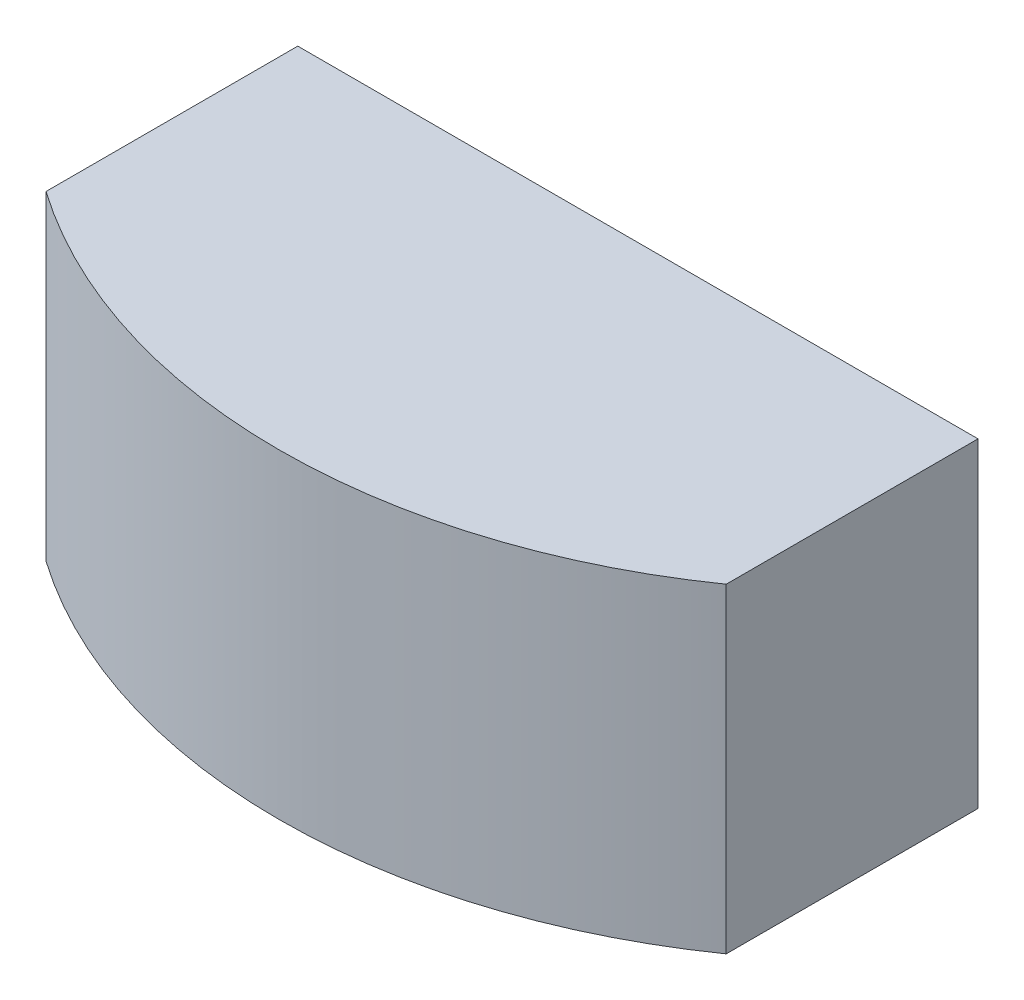
ISO-10303-21;
HEADER;
FILE_DESCRIPTION(('STEP AP214'),'2;1');
FILE_NAME('part.step','',(''),(''),'','','');
FILE_SCHEMA(('AUTOMOTIVE_DESIGN { 1 0 10303 214 1 1 1 1 }'));
ENDSEC;
DATA;
#1=APPLICATION_CONTEXT('core data for automotive mechanical design processes');
#2=APPLICATION_PROTOCOL_DEFINITION('international standard','automotive_design',2000,#1);
#3=PRODUCT_CONTEXT('',#1,'mechanical');
#4=PRODUCT('Part','Part','',(#3));
#5=PRODUCT_RELATED_PRODUCT_CATEGORY('part','',(#4));
#6=PRODUCT_DEFINITION_FORMATION('','',#4);
#7=PRODUCT_DEFINITION_CONTEXT('part definition',#1,'design');
#8=PRODUCT_DEFINITION('design','',#6,#7);
#9=PRODUCT_DEFINITION_SHAPE('','',#8);
#10=(LENGTH_UNIT() NAMED_UNIT(*) SI_UNIT(.MILLI.,.METRE.));
#11=(NAMED_UNIT(*) PLANE_ANGLE_UNIT() SI_UNIT($,.RADIAN.));
#12=(NAMED_UNIT(*) SI_UNIT($,.STERADIAN.) SOLID_ANGLE_UNIT());
#13=UNCERTAINTY_MEASURE_WITH_UNIT(LENGTH_MEASURE(1.E-05),#10,'distance_accuracy_value','');
#14=(GEOMETRIC_REPRESENTATION_CONTEXT(3) GLOBAL_UNCERTAINTY_ASSIGNED_CONTEXT((#13)) GLOBAL_UNIT_ASSIGNED_CONTEXT((#10,
#11,#12)) REPRESENTATION_CONTEXT('',''));
#15=CARTESIAN_POINT('',(0.,0.,0.));
#16=DIRECTION('',(0.,0.,1.));
#17=DIRECTION('',(1.,0.,0.));
#18=AXIS2_PLACEMENT_3D('',#15,#16,#17);
#19=CARTESIAN_POINT('',(-2.10387263166466E-12,-324.393398282201,-268.336309447892));
#20=DIRECTION('',(0.,1.,0.));
#21=DIRECTION('',(-0.656059028990481,0.,0.754709580222795));
#22=AXIS2_PLACEMENT_3D('',#19,#20,#21);
#23=CYLINDRICAL_SURFACE('',#22,675.);
#24=DIRECTION('',(0.,1.,0.));
#25=VECTOR('',#24,1.);
#26=CARTESIAN_POINT('',(-385.,-324.393398282203,286.100341577274));
#27=LINE('',#26,#25);
#28=CARTESIAN_POINT('',(-385.,-324.393398282199,286.100341577274));
#29=VERTEX_POINT('',#28);
#30=CARTESIAN_POINT('',(-385.,32.7297077300907,286.100341577275));
#31=VERTEX_POINT('',#30);
#32=EDGE_CURVE('E159',#29,#31,#27,.T.);
#33=ORIENTED_EDGE('',*,*,#32,.T.);
#34=CARTESIAN_POINT('',(-9.54062376395223E-13,32.7297077300907,-268.33630944789));
#35=DIRECTION('',(0.,1.,0.));
#36=DIRECTION('',(0.,0.,1.));
#37=AXIS2_PLACEMENT_3D('',#34,#35,#36);
#38=CIRCLE('',#37,675.);
#39=CARTESIAN_POINT('',(385.,32.7297077300907,286.100341577273));
#40=VERTEX_POINT('',#39);
#41=EDGE_CURVE('E164',#31,#40,#38,.T.);
#42=ORIENTED_EDGE('',*,*,#41,.T.);
#43=DIRECTION('',(0.,1.,0.));
#44=VECTOR('',#43,1.);
#45=CARTESIAN_POINT('',(385.,-324.393398282203,286.100341577271));
#46=LINE('',#45,#44);
#47=CARTESIAN_POINT('',(385.,-324.393398282199,286.100341577271));
#48=VERTEX_POINT('',#47);
#49=EDGE_CURVE('E163',#40,#48,#46,.F.);
#50=ORIENTED_EDGE('',*,*,#49,.T.);
#51=CARTESIAN_POINT('',(-2.10387263166465E-12,-324.393398282199,-268.336309447892));
#52=DIRECTION('',(0.,-1.,0.));
#53=DIRECTION('',(0.,0.,-1.));
#54=AXIS2_PLACEMENT_3D('',#51,#52,#53);
#55=CIRCLE('',#54,675.);
#56=EDGE_CURVE('E167',#48,#29,#55,.T.);
#57=ORIENTED_EDGE('',*,*,#56,.T.);
#58=EDGE_LOOP('',(#33,#42,#50,#57));
#59=FACE_BOUND('',#58,.T.);
#60=ADVANCED_FACE('F35',(#59),#23,.F.);
#61=CARTESIAN_POINT('',(0.,0.,5.));
#62=DIRECTION('',(0.,0.,-1.));
#63=DIRECTION('',(-1.,0.,0.));
#64=AXIS2_PLACEMENT_3D('',#61,#62,#63);
#65=PLANE('',#64);
#66=DIRECTION('',(1.,0.,0.));
#67=VECTOR('',#66,1.);
#68=CARTESIAN_POINT('',(385.,32.7297077300907,5.));
#69=LINE('',#68,#67);
#70=CARTESIAN_POINT('',(19.0562648990521,32.7297077300907,5.));
#71=VERTEX_POINT('',#70);
#72=CARTESIAN_POINT('',(385.,32.7297077300907,5.));
#73=VERTEX_POINT('',#72);
#74=EDGE_CURVE('E182',#71,#73,#69,.T.);
#75=ORIENTED_EDGE('',*,*,#74,.F.);
#76=CARTESIAN_POINT('',(2.46830333949788E-12,-47.7297077300925,5.));
#77=DIRECTION('',(0.,0.,-1.));
#78=DIRECTION('',(0.,1.,0.));
#79=AXIS2_PLACEMENT_3D('',#76,#77,#78);
#80=ELLIPSE('',#79,84.8528137423858,59.9999999999976);
#81=CARTESIAN_POINT('',(-19.0562648990495,32.7297077300907,5.));
#82=VERTEX_POINT('',#81);
#83=EDGE_CURVE('E120',#71,#82,#80,.T.);
#84=ORIENTED_EDGE('',*,*,#83,.T.);
#85=CARTESIAN_POINT('',(-385.,32.7297077300907,5.));
#86=VERTEX_POINT('',#85);
#87=EDGE_CURVE('E126',#86,#82,#69,.T.);
#88=ORIENTED_EDGE('',*,*,#87,.F.);
#89=DIRECTION('',(0.,1.,0.));
#90=VECTOR('',#89,1.);
#91=CARTESIAN_POINT('',(-385.,32.7297077300907,5.));
#92=LINE('',#91,#90);
#93=CARTESIAN_POINT('',(-385.,-324.393398282199,5.));
#94=VERTEX_POINT('',#93);
#95=EDGE_CURVE('E179',#94,#86,#92,.T.);
#96=ORIENTED_EDGE('',*,*,#95,.F.);
#97=DIRECTION('',(-1.,0.,0.));
#98=VECTOR('',#97,1.);
#99=CARTESIAN_POINT('',(385.,-324.393398282199,5.));
#100=LINE('',#99,#98);
#101=CARTESIAN_POINT('',(385.,-324.393398282199,5.));
#102=VERTEX_POINT('',#101);
#103=EDGE_CURVE('E178',#102,#94,#100,.T.);
#104=ORIENTED_EDGE('',*,*,#103,.F.);
#105=DIRECTION('',(0.,-1.,0.));
#106=VECTOR('',#105,1.);
#107=CARTESIAN_POINT('',(385.,32.7297077300907,5.));
#108=LINE('',#107,#106);
#109=EDGE_CURVE('E184',#73,#102,#108,.T.);
#110=ORIENTED_EDGE('',*,*,#109,.F.);
#111=EDGE_LOOP('',(#75,#84,#88,#96,#104,#110));
#112=FACE_BOUND('',#111,.T.);
#113=ADVANCED_FACE('F198',(#112),#65,.F.);
#114=CARTESIAN_POINT('',(385.,32.7297077300907,421.66469055211));
#115=DIRECTION('',(0.,1.,0.));
#116=DIRECTION('',(0.,0.,1.));
#117=AXIS2_PLACEMENT_3D('',#114,#115,#116);
#118=PLANE('',#117);
#119=DIRECTION('',(-1.,0.,0.));
#120=VECTOR('',#119,1.);
#121=CARTESIAN_POINT('',(385.,32.7297077300907,10.));
#122=LINE('',#121,#120);
#123=CARTESIAN_POINT('',(19.0562648990521,32.7297077300907,10.));
#124=VERTEX_POINT('',#123);
#125=CARTESIAN_POINT('',(-19.0562648990495,32.7297077300907,10.));
#126=VERTEX_POINT('',#125);
#127=EDGE_CURVE('E111',#124,#126,#122,.T.);
#128=ORIENTED_EDGE('',*,*,#127,.F.);
#129=DIRECTION('',(0.,0.,-1.));
#130=VECTOR('',#129,1.);
#131=CARTESIAN_POINT('',(19.0562648990521,32.7297077300907,10.));
#132=LINE('',#131,#130);
#133=EDGE_CURVE('E12',#124,#71,#132,.T.);
#134=ORIENTED_EDGE('',*,*,#133,.T.);
#135=ORIENTED_EDGE('',*,*,#74,.T.);
#136=DIRECTION('',(0.,0.,-1.));
#137=VECTOR('',#136,1.);
#138=CARTESIAN_POINT('',(385.,32.7297077300907,421.66469055211));
#139=LINE('',#138,#137);
#140=EDGE_CURVE('E160',#40,#73,#139,.T.);
#141=ORIENTED_EDGE('',*,*,#140,.F.);
#142=ORIENTED_EDGE('',*,*,#41,.F.);
#143=DIRECTION('',(0.,0.,-1.));
#144=VECTOR('',#143,1.);
#145=CARTESIAN_POINT('',(-385.,32.7297077300907,421.66469055211));
#146=LINE('',#145,#144);
#147=EDGE_CURVE('E130',#31,#86,#146,.T.);
#148=ORIENTED_EDGE('',*,*,#147,.T.);
#149=ORIENTED_EDGE('',*,*,#87,.T.);
#150=DIRECTION('',(0.,0.,-1.));
#151=VECTOR('',#150,1.);
#152=CARTESIAN_POINT('',(-19.0562648990495,32.7297077300907,10.));
#153=LINE('',#152,#151);
#154=EDGE_CURVE('E43',#82,#126,#153,.F.);
#155=ORIENTED_EDGE('',*,*,#154,.T.);
#156=EDGE_LOOP('',(#128,#134,#135,#141,#142,#148,#149,#155));
#157=FACE_BOUND('',#156,.T.);
#158=ADVANCED_FACE('F124',(#157),#118,.F.);
#159=CARTESIAN_POINT('',(385.,32.7297077300907,421.66469055211));
#160=DIRECTION('',(1.,0.,0.));
#161=DIRECTION('',(0.,0.,-1.));
#162=AXIS2_PLACEMENT_3D('',#159,#160,#161);
#163=PLANE('',#162);
#164=ORIENTED_EDGE('',*,*,#140,.T.);
#165=ORIENTED_EDGE('',*,*,#109,.T.);
#166=DIRECTION('',(0.,0.,-1.));
#167=VECTOR('',#166,1.);
#168=CARTESIAN_POINT('',(385.,-324.393398282199,421.66469055211));
#169=LINE('',#168,#167);
#170=EDGE_CURVE('E165',#48,#102,#169,.T.);
#171=ORIENTED_EDGE('',*,*,#170,.F.);
#172=ORIENTED_EDGE('',*,*,#49,.F.);
#173=EDGE_LOOP('',(#164,#165,#171,#172));
#174=FACE_BOUND('',#173,.T.);
#175=ADVANCED_FACE('F208',(#174),#163,.F.);
#176=CARTESIAN_POINT('',(385.,-324.393398282199,421.66469055211));
#177=DIRECTION('',(0.,-1.,0.));
#178=DIRECTION('',(0.,0.,-1.));
#179=AXIS2_PLACEMENT_3D('',#176,#177,#178);
#180=PLANE('',#179);
#181=ORIENTED_EDGE('',*,*,#170,.T.);
#182=ORIENTED_EDGE('',*,*,#103,.T.);
#183=DIRECTION('',(0.,0.,-1.));
#184=VECTOR('',#183,1.);
#185=CARTESIAN_POINT('',(-385.,-324.393398282199,421.66469055211));
#186=LINE('',#185,#184);
#187=EDGE_CURVE('E168',#29,#94,#186,.T.);
#188=ORIENTED_EDGE('',*,*,#187,.F.);
#189=ORIENTED_EDGE('',*,*,#56,.F.);
#190=EDGE_LOOP('',(#181,#182,#188,#189));
#191=FACE_BOUND('',#190,.T.);
#192=ADVANCED_FACE('F204',(#191),#180,.F.);
#193=CARTESIAN_POINT('',(-385.,32.7297077300907,421.66469055211));
#194=DIRECTION('',(-1.,0.,0.));
#195=DIRECTION('',(0.,0.,1.));
#196=AXIS2_PLACEMENT_3D('',#193,#194,#195);
#197=PLANE('',#196);
#198=ORIENTED_EDGE('',*,*,#187,.T.);
#199=ORIENTED_EDGE('',*,*,#95,.T.);
#200=ORIENTED_EDGE('',*,*,#147,.F.);
#201=ORIENTED_EDGE('',*,*,#32,.F.);
#202=EDGE_LOOP('',(#198,#199,#200,#201));
#203=FACE_BOUND('',#202,.T.);
#204=ADVANCED_FACE('F196',(#203),#197,.F.);
#205=CARTESIAN_POINT('',(2.46830333949788E-12,-47.7297077300925,10.));
#206=DIRECTION('',(0.,0.,-1.));
#207=DIRECTION('',(0.,1.,0.));
#208=AXIS2_PLACEMENT_3D('',#205,#206,#207);
#209=ELLIPSE('',#208,84.8528137423858,59.9999999999976);
#210=DIRECTION('',(0.,0.,-1.));
#211=VECTOR('',#210,1.);
#212=SURFACE_OF_LINEAR_EXTRUSION('',#209,#211);
#213=CARTESIAN_POINT('',(2.46830333949788E-12,-47.7297077300925,0.));
#214=DIRECTION('',(0.,0.,-1.));
#215=DIRECTION('',(0.,1.,0.));
#216=AXIS2_PLACEMENT_3D('',#213,#214,#215);
#217=ELLIPSE('',#216,84.8528137423858,59.9999999999976);
#218=CARTESIAN_POINT('',(0.,37.1231060122933,0.));
#219=VERTEX_POINT('',#218);
#220=EDGE_CURVE('E121',#219,#219,#217,.T.);
#221=ORIENTED_EDGE('',*,*,#220,.T.);
#222=EDGE_LOOP('',(#221));
#223=FACE_BOUND('',#222,.T.);
#224=EDGE_CURVE('E49',#126,#124,#209,.T.);
#225=ORIENTED_EDGE('',*,*,#224,.F.);
#226=ORIENTED_EDGE('',*,*,#154,.F.);
#227=ORIENTED_EDGE('',*,*,#83,.F.);
#228=ORIENTED_EDGE('',*,*,#133,.F.);
#229=EDGE_LOOP('',(#225,#226,#227,#228));
#230=FACE_BOUND('',#229,.T.);
#231=ADVANCED_FACE('F118',(#223,#230),#212,.F.);
#232=CARTESIAN_POINT('',(2.46830333949788E-12,-47.7297077300925,10.));
#233=DIRECTION('',(0.,0.,-1.));
#234=DIRECTION('',(-1.,0.,0.));
#235=AXIS2_PLACEMENT_3D('',#232,#233,#234);
#236=PLANE('',#235);
#237=ORIENTED_EDGE('',*,*,#127,.T.);
#238=ORIENTED_EDGE('',*,*,#224,.T.);
#239=EDGE_LOOP('',(#237,#238));
#240=FACE_BOUND('',#239,.T.);
#241=ADVANCED_FACE('F112',(#240),#236,.T.);
#242=CARTESIAN_POINT('',(-390.000000000001,-329.393398282201,411.664690552111));
#243=DIRECTION('',(0.,1.,0.));
#244=DIRECTION('',(-1.,0.,0.));
#245=AXIS2_PLACEMENT_3D('',#242,#243,#244);
#246=PLANE('',#245);
#247=CARTESIAN_POINT('',(-2.11997086552173E-12,-329.393398282203,-268.336309447892));
#248=DIRECTION('',(0.,1.,0.));
#249=DIRECTION('',(-1.,0.,0.));
#250=AXIS2_PLACEMENT_3D('',#247,#248,#249);
#251=CIRCLE('',#250,680.);
#252=CARTESIAN_POINT('',(-390.000000000001,-329.393398282201,288.709469640327));
#253=VERTEX_POINT('',#252);
#254=CARTESIAN_POINT('',(389.999999999999,-329.393398282204,288.709469640326));
#255=VERTEX_POINT('',#254);
#256=EDGE_CURVE('E143',#253,#255,#251,.T.);
#257=ORIENTED_EDGE('',*,*,#256,.F.);
#258=DIRECTION('',(0.,0.,-1.));
#259=VECTOR('',#258,1.);
#260=CARTESIAN_POINT('',(-390.000000000001,-329.393398282201,411.664690552111));
#261=LINE('',#260,#259);
#262=CARTESIAN_POINT('',(-390.000000000001,-329.393398282201,0.));
#263=VERTEX_POINT('',#262);
#264=EDGE_CURVE('E57',#253,#263,#261,.T.);
#265=ORIENTED_EDGE('',*,*,#264,.T.);
#266=DIRECTION('',(1.,0.,0.));
#267=VECTOR('',#266,1.);
#268=CARTESIAN_POINT('',(-390.000000000001,-329.393398282201,0.));
#269=LINE('',#268,#267);
#270=CARTESIAN_POINT('',(389.999999999999,-329.393398282204,0.));
#271=VERTEX_POINT('',#270);
#272=EDGE_CURVE('E129',#263,#271,#269,.T.);
#273=ORIENTED_EDGE('',*,*,#272,.T.);
#274=DIRECTION('',(0.,0.,-1.));
#275=VECTOR('',#274,1.);
#276=CARTESIAN_POINT('',(389.999999999999,-329.393398282204,411.664690552111));
#277=LINE('',#276,#275);
#278=EDGE_CURVE('E138',#255,#271,#277,.T.);
#279=ORIENTED_EDGE('',*,*,#278,.F.);
#280=EDGE_LOOP('',(#257,#265,#273,#279));
#281=FACE_BOUND('',#280,.T.);
#282=ADVANCED_FACE('F231',(#281),#246,.F.);
#283=CARTESIAN_POINT('',(389.999999999999,-329.393398282204,411.664690552111));
#284=DIRECTION('',(-1.,0.,0.));
#285=DIRECTION('',(0.,-1.,0.));
#286=AXIS2_PLACEMENT_3D('',#283,#284,#285);
#287=PLANE('',#286);
#288=DIRECTION('',(0.,1.,0.));
#289=VECTOR('',#288,1.);
#290=CARTESIAN_POINT('',(389.999999999999,-324.393398282204,288.709469640325));
#291=LINE('',#290,#289);
#292=CARTESIAN_POINT('',(390.000000000001,37.7297077300907,288.709469640327));
#293=VERTEX_POINT('',#292);
#294=EDGE_CURVE('E146',#255,#293,#291,.T.);
#295=ORIENTED_EDGE('',*,*,#294,.F.);
#296=ORIENTED_EDGE('',*,*,#278,.T.);
#297=DIRECTION('',(0.,1.,0.));
#298=VECTOR('',#297,1.);
#299=CARTESIAN_POINT('',(389.999999999999,-329.393398282204,0.));
#300=LINE('',#299,#298);
#301=CARTESIAN_POINT('',(390.000000000001,37.7297077300907,0.));
#302=VERTEX_POINT('',#301);
#303=EDGE_CURVE('E137',#271,#302,#300,.T.);
#304=ORIENTED_EDGE('',*,*,#303,.T.);
#305=DIRECTION('',(0.,0.,-1.));
#306=VECTOR('',#305,1.);
#307=CARTESIAN_POINT('',(390.000000000001,37.7297077300907,411.664690552111));
#308=LINE('',#307,#306);
#309=EDGE_CURVE('E135',#293,#302,#308,.T.);
#310=ORIENTED_EDGE('',*,*,#309,.F.);
#311=EDGE_LOOP('',(#295,#296,#304,#310));
#312=FACE_BOUND('',#311,.T.);
#313=ADVANCED_FACE('F228',(#312),#287,.F.);
#314=CARTESIAN_POINT('',(390.000000000001,37.7297077300907,411.664690552111));
#315=DIRECTION('',(0.,-1.,0.));
#316=DIRECTION('',(1.,0.,0.));
#317=AXIS2_PLACEMENT_3D('',#314,#315,#316);
#318=PLANE('',#317);
#319=CARTESIAN_POINT('',(-9.37964142538154E-13,37.7297077300919,-268.33630944789));
#320=DIRECTION('',(0.,-1.,0.));
#321=DIRECTION('',(1.,0.,0.));
#322=AXIS2_PLACEMENT_3D('',#319,#320,#321);
#323=CIRCLE('',#322,680.);
#324=CARTESIAN_POINT('',(-390.,37.7297077300931,288.709469640328));
#325=VERTEX_POINT('',#324);
#326=EDGE_CURVE('E115',#293,#325,#323,.T.);
#327=ORIENTED_EDGE('',*,*,#326,.F.);
#328=ORIENTED_EDGE('',*,*,#309,.T.);
#329=DIRECTION('',(-1.,0.,0.));
#330=VECTOR('',#329,1.);
#331=CARTESIAN_POINT('',(390.000000000001,37.7297077300907,0.));
#332=LINE('',#331,#330);
#333=CARTESIAN_POINT('',(-390.,37.7297077300931,0.));
#334=VERTEX_POINT('',#333);
#335=EDGE_CURVE('E134',#302,#334,#332,.T.);
#336=ORIENTED_EDGE('',*,*,#335,.T.);
#337=DIRECTION('',(0.,0.,-1.));
#338=VECTOR('',#337,1.);
#339=CARTESIAN_POINT('',(-390.,37.7297077300931,411.664690552111));
#340=LINE('',#339,#338);
#341=EDGE_CURVE('E131',#325,#334,#340,.T.);
#342=ORIENTED_EDGE('',*,*,#341,.F.);
#343=EDGE_LOOP('',(#327,#328,#336,#342));
#344=FACE_BOUND('',#343,.T.);
#345=ADVANCED_FACE('F225',(#344),#318,.F.);
#346=CARTESIAN_POINT('',(-390.,37.7297077300931,411.664690552111));
#347=DIRECTION('',(1.,0.,0.));
#348=DIRECTION('',(0.,1.,0.));
#349=AXIS2_PLACEMENT_3D('',#346,#347,#348);
#350=PLANE('',#349);
#351=DIRECTION('',(0.,1.,0.));
#352=VECTOR('',#351,1.);
#353=CARTESIAN_POINT('',(-390.000000000001,-324.393398282202,288.709469640327));
#354=LINE('',#353,#352);
#355=EDGE_CURVE('E140',#325,#253,#354,.F.);
#356=ORIENTED_EDGE('',*,*,#355,.F.);
#357=ORIENTED_EDGE('',*,*,#341,.T.);
#358=DIRECTION('',(0.,-1.,0.));
#359=VECTOR('',#358,1.);
#360=CARTESIAN_POINT('',(-390.,37.7297077300931,0.));
#361=LINE('',#360,#359);
#362=EDGE_CURVE('E133',#334,#263,#361,.T.);
#363=ORIENTED_EDGE('',*,*,#362,.T.);
#364=ORIENTED_EDGE('',*,*,#264,.F.);
#365=EDGE_LOOP('',(#356,#357,#363,#364));
#366=FACE_BOUND('',#365,.T.);
#367=ADVANCED_FACE('F221',(#366),#350,.F.);
#368=CARTESIAN_POINT('',(0.,0.,0.));
#369=DIRECTION('',(0.,0.,1.));
#370=DIRECTION('',(1.,0.,0.));
#371=AXIS2_PLACEMENT_3D('',#368,#369,#370);
#372=PLANE('',#371);
#373=ORIENTED_EDGE('',*,*,#220,.F.);
#374=EDGE_LOOP('',(#373));
#375=FACE_BOUND('',#374,.T.);
#376=ORIENTED_EDGE('',*,*,#272,.F.);
#377=ORIENTED_EDGE('',*,*,#362,.F.);
#378=ORIENTED_EDGE('',*,*,#335,.F.);
#379=ORIENTED_EDGE('',*,*,#303,.F.);
#380=EDGE_LOOP('',(#376,#377,#378,#379));
#381=FACE_BOUND('',#380,.T.);
#382=ADVANCED_FACE('F218',(#375,#381),#372,.F.);
#383=CARTESIAN_POINT('',(-2.10387263166466E-12,-324.393398282201,-268.336309447892));
#384=DIRECTION('',(0.,1.,0.));
#385=DIRECTION('',(-0.656059028990481,0.,0.754709580222795));
#386=AXIS2_PLACEMENT_3D('',#383,#384,#385);
#387=CYLINDRICAL_SURFACE('',#386,680.);
#388=ORIENTED_EDGE('',*,*,#355,.T.);
#389=ORIENTED_EDGE('',*,*,#256,.T.);
#390=ORIENTED_EDGE('',*,*,#294,.T.);
#391=ORIENTED_EDGE('',*,*,#326,.T.);
#392=EDGE_LOOP('',(#388,#389,#390,#391));
#393=FACE_BOUND('',#392,.T.);
#394=ADVANCED_FACE('F37',(#393),#387,.T.);
#395=CLOSED_SHELL('',(#60,#113,#158,#175,#192,#204,#231,#241,#282,#313,#345,#367,#382,#394));
#396=MANIFOLD_SOLID_BREP('B2',#395);
#397=ADVANCED_BREP_SHAPE_REPRESENTATION('',(#18,#396),#14);
#398=SHAPE_DEFINITION_REPRESENTATION(#9,#397);
ENDSEC;
END-ISO-10303-21;
